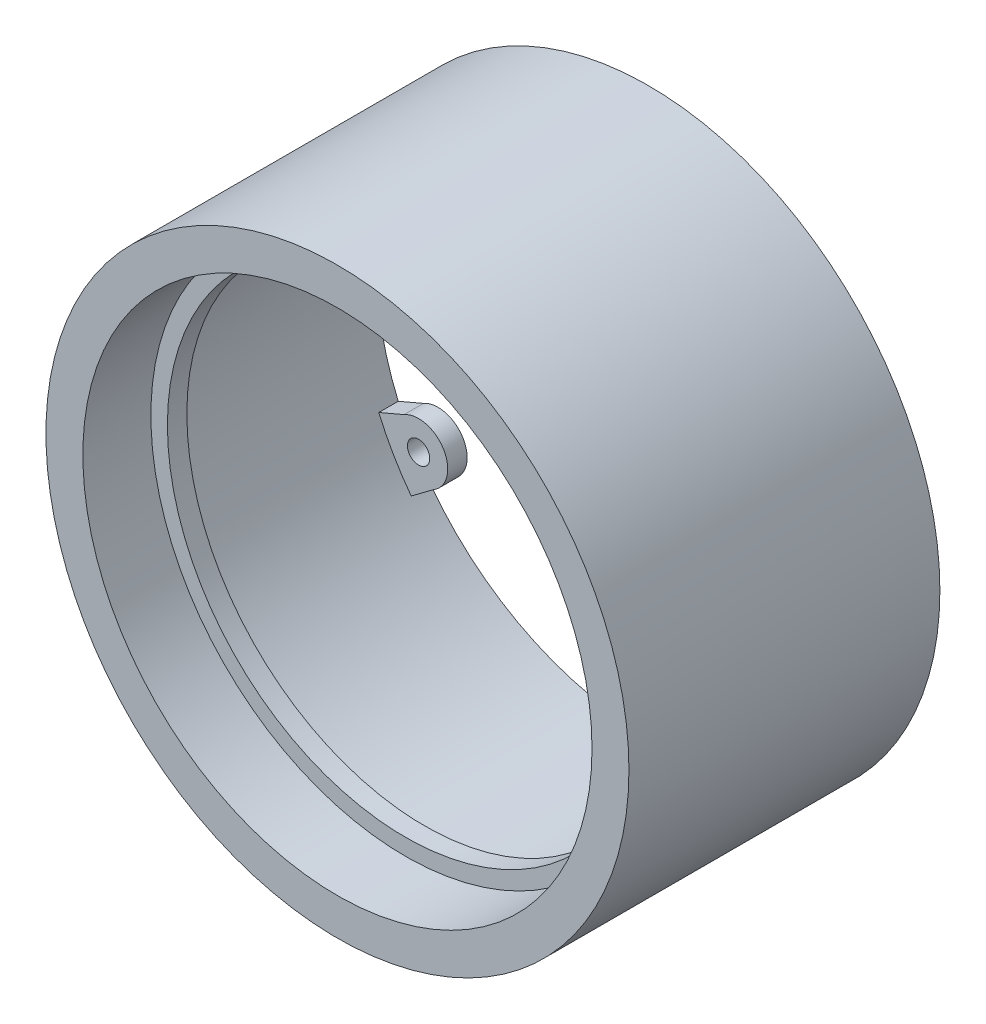
ISO-10303-21;
HEADER;
FILE_DESCRIPTION(('STEP AP214'),'2;1');
FILE_NAME('part.step','',(''),(''),'','','');
FILE_SCHEMA(('AUTOMOTIVE_DESIGN { 1 0 10303 214 1 1 1 1 }'));
ENDSEC;
DATA;
#1=APPLICATION_CONTEXT('core data for automotive mechanical design processes');
#2=APPLICATION_PROTOCOL_DEFINITION('international standard','automotive_design',2000,#1);
#3=PRODUCT_CONTEXT('',#1,'mechanical');
#4=PRODUCT('Part','Part','',(#3));
#5=PRODUCT_RELATED_PRODUCT_CATEGORY('part','',(#4));
#6=PRODUCT_DEFINITION_FORMATION('','',#4);
#7=PRODUCT_DEFINITION_CONTEXT('part definition',#1,'design');
#8=PRODUCT_DEFINITION('design','',#6,#7);
#9=PRODUCT_DEFINITION_SHAPE('','',#8);
#10=(LENGTH_UNIT() NAMED_UNIT(*) SI_UNIT(.MILLI.,.METRE.));
#11=(NAMED_UNIT(*) PLANE_ANGLE_UNIT() SI_UNIT($,.RADIAN.));
#12=(NAMED_UNIT(*) SI_UNIT($,.STERADIAN.) SOLID_ANGLE_UNIT());
#13=UNCERTAINTY_MEASURE_WITH_UNIT(LENGTH_MEASURE(1.E-05),#10,'distance_accuracy_value','');
#14=(GEOMETRIC_REPRESENTATION_CONTEXT(3) GLOBAL_UNCERTAINTY_ASSIGNED_CONTEXT((#13)) GLOBAL_UNIT_ASSIGNED_CONTEXT((#10,
#11,#12)) REPRESENTATION_CONTEXT('',''));
#15=CARTESIAN_POINT('',(0.,0.,0.));
#16=DIRECTION('',(0.,0.,1.));
#17=DIRECTION('',(1.,0.,0.));
#18=AXIS2_PLACEMENT_3D('',#15,#16,#17);
#19=CARTESIAN_POINT('',(0.,0.,25.));
#20=DIRECTION('',(0.,0.,1.));
#21=DIRECTION('',(1.,0.,0.));
#22=AXIS2_PLACEMENT_3D('',#19,#20,#21);
#23=PLANE('',#22);
#24=CARTESIAN_POINT('',(0.,0.,25.));
#25=DIRECTION('',(0.,0.,1.));
#26=DIRECTION('',(1.,0.,0.));
#27=AXIS2_PLACEMENT_3D('',#24,#25,#26);
#28=CIRCLE('',#27,24.5);
#29=CARTESIAN_POINT('',(24.5,0.,25.));
#30=VERTEX_POINT('',#29);
#31=EDGE_CURVE('E409',#30,#30,#28,.T.);
#32=ORIENTED_EDGE('',*,*,#31,.F.);
#33=EDGE_LOOP('',(#32));
#34=FACE_BOUND('',#33,.T.);
#35=CARTESIAN_POINT('',(0.,0.,25.));
#36=DIRECTION('',(0.,0.,1.));
#37=DIRECTION('',(1.,0.,0.));
#38=AXIS2_PLACEMENT_3D('',#35,#36,#37);
#39=CIRCLE('',#38,26.2);
#40=CARTESIAN_POINT('',(26.2,0.,25.));
#41=VERTEX_POINT('',#40);
#42=EDGE_CURVE('E620',#41,#41,#39,.T.);
#43=ORIENTED_EDGE('',*,*,#42,.T.);
#44=EDGE_LOOP('',(#43));
#45=FACE_BOUND('',#44,.T.);
#46=ADVANCED_FACE('F45',(#34,#45),#23,.T.);
#47=CARTESIAN_POINT('',(0.,0.,23.));
#48=DIRECTION('',(0.,0.,-1.));
#49=DIRECTION('',(-1.,0.,0.));
#50=AXIS2_PLACEMENT_3D('',#47,#48,#49);
#51=CYLINDRICAL_SURFACE('',#50,28.);
#52=CARTESIAN_POINT('',(0.,0.,23.));
#53=DIRECTION('',(0.,0.,1.));
#54=DIRECTION('',(1.,0.,0.));
#55=AXIS2_PLACEMENT_3D('',#52,#53,#54);
#56=CIRCLE('',#55,28.);
#57=CARTESIAN_POINT('',(28.,0.,23.));
#58=VERTEX_POINT('',#57);
#59=EDGE_CURVE('E365',#58,#58,#56,.T.);
#60=ORIENTED_EDGE('',*,*,#59,.T.);
#61=EDGE_LOOP('',(#60));
#62=FACE_BOUND('',#61,.T.);
#63=CARTESIAN_POINT('',(0.,0.,2.));
#64=DIRECTION('',(0.,0.,1.));
#65=DIRECTION('',(-1.,0.,0.));
#66=AXIS2_PLACEMENT_3D('',#63,#64,#65);
#67=CIRCLE('',#66,28.);
#68=CARTESIAN_POINT('',(3.33606617731603,27.8005514776338,2.));
#69=VERTEX_POINT('',#68);
#70=CARTESIAN_POINT('',(-3.33606617731606,27.8005514776338,2.));
#71=VERTEX_POINT('',#70);
#72=EDGE_CURVE('E194',#69,#71,#67,.T.);
#73=ORIENTED_EDGE('',*,*,#72,.F.);
#74=DIRECTION('',(0.,0.,-1.));
#75=VECTOR('',#74,1.);
#76=CARTESIAN_POINT('',(3.33606617731603,27.8005514776338,2.));
#77=LINE('',#76,#75);
#78=CARTESIAN_POINT('',(3.33606617731603,27.8005514776338,0.));
#79=VERTEX_POINT('',#78);
#80=EDGE_CURVE('E190',#69,#79,#77,.T.);
#81=ORIENTED_EDGE('',*,*,#80,.T.);
#82=CARTESIAN_POINT('',(0.,0.,0.));
#83=DIRECTION('',(0.,0.,1.));
#84=DIRECTION('',(1.,0.,0.));
#85=AXIS2_PLACEMENT_3D('',#82,#83,#84);
#86=CIRCLE('',#85,28.);
#87=CARTESIAN_POINT('',(22.4079507301899,16.7893937970787,0.));
#88=VERTEX_POINT('',#87);
#89=EDGE_CURVE('E54',#88,#79,#86,.T.);
#90=ORIENTED_EDGE('',*,*,#89,.F.);
#91=DIRECTION('',(0.,0.,-1.));
#92=VECTOR('',#91,1.);
#93=CARTESIAN_POINT('',(22.4079507301899,16.7893937970787,2.));
#94=LINE('',#93,#92);
#95=CARTESIAN_POINT('',(22.4079507301899,16.7893937970787,2.));
#96=VERTEX_POINT('',#95);
#97=EDGE_CURVE('E228',#96,#88,#94,.T.);
#98=ORIENTED_EDGE('',*,*,#97,.F.);
#99=CARTESIAN_POINT('',(0.,0.,2.));
#100=DIRECTION('',(0.,0.,1.));
#101=DIRECTION('',(-1.,0.,0.));
#102=AXIS2_PLACEMENT_3D('',#99,#100,#101);
#103=CIRCLE('',#102,28.);
#104=CARTESIAN_POINT('',(25.7440169075059,11.0111576805552,2.));
#105=VERTEX_POINT('',#104);
#106=EDGE_CURVE('E249',#105,#96,#103,.T.);
#107=ORIENTED_EDGE('',*,*,#106,.F.);
#108=DIRECTION('',(0.,0.,-1.));
#109=VECTOR('',#108,1.);
#110=CARTESIAN_POINT('',(25.7440169075059,11.0111576805552,2.));
#111=LINE('',#110,#109);
#112=CARTESIAN_POINT('',(25.7440169075059,11.0111576805552,0.));
#113=VERTEX_POINT('',#112);
#114=EDGE_CURVE('E223',#105,#113,#111,.T.);
#115=ORIENTED_EDGE('',*,*,#114,.T.);
#116=CARTESIAN_POINT('',(25.7440169075059,-11.0111576805552,0.));
#117=VERTEX_POINT('',#116);
#118=EDGE_CURVE('E209',#117,#113,#86,.T.);
#119=ORIENTED_EDGE('',*,*,#118,.F.);
#120=DIRECTION('',(0.,0.,-1.));
#121=VECTOR('',#120,1.);
#122=CARTESIAN_POINT('',(25.7440169075059,-11.0111576805552,2.));
#123=LINE('',#122,#121);
#124=CARTESIAN_POINT('',(25.7440169075059,-11.0111576805552,2.));
#125=VERTEX_POINT('',#124);
#126=EDGE_CURVE('E275',#125,#117,#123,.T.);
#127=ORIENTED_EDGE('',*,*,#126,.F.);
#128=CARTESIAN_POINT('',(0.,0.,2.));
#129=DIRECTION('',(0.,0.,1.));
#130=DIRECTION('',(-1.,0.,0.));
#131=AXIS2_PLACEMENT_3D('',#128,#129,#130);
#132=CIRCLE('',#131,28.);
#133=CARTESIAN_POINT('',(22.4079507301899,-16.7893937970786,2.));
#134=VERTEX_POINT('',#133);
#135=EDGE_CURVE('E297',#134,#125,#132,.T.);
#136=ORIENTED_EDGE('',*,*,#135,.F.);
#137=DIRECTION('',(0.,0.,-1.));
#138=VECTOR('',#137,1.);
#139=CARTESIAN_POINT('',(22.4079507301899,-16.7893937970786,2.));
#140=LINE('',#139,#138);
#141=CARTESIAN_POINT('',(22.4079507301899,-16.7893937970786,0.));
#142=VERTEX_POINT('',#141);
#143=EDGE_CURVE('E270',#134,#142,#140,.T.);
#144=ORIENTED_EDGE('',*,*,#143,.T.);
#145=CARTESIAN_POINT('',(-22.4079507301899,-16.7893937970787,0.));
#146=VERTEX_POINT('',#145);
#147=EDGE_CURVE('E214',#146,#142,#86,.T.);
#148=ORIENTED_EDGE('',*,*,#147,.F.);
#149=DIRECTION('',(0.,0.,-1.));
#150=VECTOR('',#149,1.);
#151=CARTESIAN_POINT('',(-22.4079507301899,-16.7893937970787,2.));
#152=LINE('',#151,#150);
#153=CARTESIAN_POINT('',(-22.4079507301899,-16.7893937970787,2.));
#154=VERTEX_POINT('',#153);
#155=EDGE_CURVE('E322',#154,#146,#152,.T.);
#156=ORIENTED_EDGE('',*,*,#155,.F.);
#157=CARTESIAN_POINT('',(0.,0.,2.));
#158=DIRECTION('',(0.,0.,1.));
#159=DIRECTION('',(-1.,0.,0.));
#160=AXIS2_PLACEMENT_3D('',#157,#158,#159);
#161=CIRCLE('',#160,28.);
#162=CARTESIAN_POINT('',(-25.7440169075059,-11.0111576805552,2.));
#163=VERTEX_POINT('',#162);
#164=EDGE_CURVE('E344',#163,#154,#161,.T.);
#165=ORIENTED_EDGE('',*,*,#164,.F.);
#166=DIRECTION('',(0.,0.,-1.));
#167=VECTOR('',#166,1.);
#168=CARTESIAN_POINT('',(-25.7440169075059,-11.0111576805552,2.));
#169=LINE('',#168,#167);
#170=CARTESIAN_POINT('',(-25.7440169075059,-11.0111576805552,0.));
#171=VERTEX_POINT('',#170);
#172=EDGE_CURVE('E317',#163,#171,#169,.T.);
#173=ORIENTED_EDGE('',*,*,#172,.T.);
#174=CARTESIAN_POINT('',(-25.7440169075059,11.0111576805551,0.));
#175=VERTEX_POINT('',#174);
#176=EDGE_CURVE('E460',#175,#171,#86,.T.);
#177=ORIENTED_EDGE('',*,*,#176,.F.);
#178=DIRECTION('',(0.,0.,-1.));
#179=VECTOR('',#178,1.);
#180=CARTESIAN_POINT('',(-25.7440169075059,11.0111576805551,2.));
#181=LINE('',#180,#179);
#182=CARTESIAN_POINT('',(-25.7440169075059,11.0111576805551,2.));
#183=VERTEX_POINT('',#182);
#184=EDGE_CURVE('E369',#183,#175,#181,.T.);
#185=ORIENTED_EDGE('',*,*,#184,.F.);
#186=CARTESIAN_POINT('',(0.,0.,2.));
#187=DIRECTION('',(0.,0.,1.));
#188=DIRECTION('',(-1.,0.,0.));
#189=AXIS2_PLACEMENT_3D('',#186,#187,#188);
#190=CIRCLE('',#189,28.);
#191=CARTESIAN_POINT('',(-22.4079507301899,16.7893937970786,2.));
#192=VERTEX_POINT('',#191);
#193=EDGE_CURVE('E391',#192,#183,#190,.T.);
#194=ORIENTED_EDGE('',*,*,#193,.F.);
#195=DIRECTION('',(0.,0.,-1.));
#196=VECTOR('',#195,1.);
#197=CARTESIAN_POINT('',(-22.4079507301899,16.7893937970786,2.));
#198=LINE('',#197,#196);
#199=CARTESIAN_POINT('',(-22.4079507301899,16.7893937970786,0.));
#200=VERTEX_POINT('',#199);
#201=EDGE_CURVE('E364',#192,#200,#198,.T.);
#202=ORIENTED_EDGE('',*,*,#201,.T.);
#203=CARTESIAN_POINT('',(-3.33606617731606,27.8005514776338,0.));
#204=VERTEX_POINT('',#203);
#205=EDGE_CURVE('E455',#204,#200,#86,.T.);
#206=ORIENTED_EDGE('',*,*,#205,.F.);
#207=DIRECTION('',(0.,0.,-1.));
#208=VECTOR('',#207,1.);
#209=CARTESIAN_POINT('',(-3.33606617731606,27.8005514776338,2.));
#210=LINE('',#209,#208);
#211=EDGE_CURVE('E215',#71,#204,#210,.T.);
#212=ORIENTED_EDGE('',*,*,#211,.F.);
#213=EDGE_LOOP('',(#73,#81,#90,#98,#107,#115,#119,#127,#136,#144,#148,#156,#165,#173,#177,#185,
#194,#202,#206,#212));
#214=FACE_BOUND('',#213,.T.);
#215=ADVANCED_FACE('F456',(#62,#214),#51,.F.);
#216=CARTESIAN_POINT('',(0.,0.,0.));
#217=DIRECTION('',(0.,0.,1.));
#218=DIRECTION('',(1.,0.,0.));
#219=AXIS2_PLACEMENT_3D('',#216,#217,#218);
#220=PLANE('',#219);
#221=CARTESIAN_POINT('',(0.,0.,0.));
#222=DIRECTION('',(0.,0.,1.));
#223=DIRECTION('',(1.,0.,0.));
#224=AXIS2_PLACEMENT_3D('',#221,#222,#223);
#225=CIRCLE('',#224,30.);
#226=CARTESIAN_POINT('',(30.,0.,0.));
#227=VERTEX_POINT('',#226);
#228=EDGE_CURVE('E11',#227,#227,#225,.T.);
#229=ORIENTED_EDGE('',*,*,#228,.F.);
#230=EDGE_LOOP('',(#229));
#231=FACE_BOUND('',#230,.T.);
#232=ORIENTED_EDGE('',*,*,#118,.T.);
#233=DIRECTION('',(0.919429175268066,0.393255631448406,0.));
#234=VECTOR('',#233,1.);
#235=CARTESIAN_POINT('',(23.150635094611,9.90192378864669,0.));
#236=LINE('',#235,#234);
#237=CARTESIAN_POINT('',(23.150635094611,9.90192378864669,0.));
#238=VERTEX_POINT('',#237);
#239=EDGE_CURVE('E238',#238,#113,#236,.T.);
#240=ORIENTED_EDGE('',*,*,#239,.F.);
#241=CARTESIAN_POINT('',(21.650635094611,12.5,0.));
#242=DIRECTION('',(0.,0.,1.));
#243=DIRECTION('',(1.,0.,0.));
#244=AXIS2_PLACEMENT_3D('',#241,#242,#243);
#245=CIRCLE('',#244,3.);
#246=CARTESIAN_POINT('',(20.150635094611,15.0980762113533,0.));
#247=VERTEX_POINT('',#246);
#248=EDGE_CURVE('E242',#247,#238,#245,.T.);
#249=ORIENTED_EDGE('',*,*,#248,.F.);
#250=DIRECTION('',(-0.800283954649639,-0.599621207038522,0.));
#251=VECTOR('',#250,1.);
#252=CARTESIAN_POINT('',(20.150635094611,15.0980762113533,0.));
#253=LINE('',#252,#251);
#254=EDGE_CURVE('E235',#88,#247,#253,.T.);
#255=ORIENTED_EDGE('',*,*,#254,.F.);
#256=ORIENTED_EDGE('',*,*,#89,.T.);
#257=DIRECTION('',(0.119145220618423,0.992876838486923,0.));
#258=VECTOR('',#257,1.);
#259=CARTESIAN_POINT('',(3.,25.,0.));
#260=LINE('',#259,#258);
#261=CARTESIAN_POINT('',(3.,25.,0.));
#262=VERTEX_POINT('',#261);
#263=EDGE_CURVE('E439',#262,#79,#260,.T.);
#264=ORIENTED_EDGE('',*,*,#263,.F.);
#265=CARTESIAN_POINT('',(0.,25.,0.));
#266=DIRECTION('',(0.,0.,1.));
#267=DIRECTION('',(1.,0.,0.));
#268=AXIS2_PLACEMENT_3D('',#265,#266,#267);
#269=CIRCLE('',#268,3.);
#270=CARTESIAN_POINT('',(-3.,25.,0.));
#271=VERTEX_POINT('',#270);
#272=EDGE_CURVE('E207',#271,#262,#269,.T.);
#273=ORIENTED_EDGE('',*,*,#272,.F.);
#274=DIRECTION('',(0.11914522061843,-0.992876838486922,0.));
#275=VECTOR('',#274,1.);
#276=CARTESIAN_POINT('',(-3.,25.,0.));
#277=LINE('',#276,#275);
#278=EDGE_CURVE('E203',#204,#271,#277,.T.);
#279=ORIENTED_EDGE('',*,*,#278,.F.);
#280=ORIENTED_EDGE('',*,*,#205,.T.);
#281=DIRECTION('',(-0.800283954649644,0.599621207038517,0.));
#282=VECTOR('',#281,1.);
#283=CARTESIAN_POINT('',(-20.150635094611,15.0980762113533,0.));
#284=LINE('',#283,#282);
#285=CARTESIAN_POINT('',(-20.150635094611,15.0980762113533,0.));
#286=VERTEX_POINT('',#285);
#287=EDGE_CURVE('E380',#286,#200,#284,.T.);
#288=ORIENTED_EDGE('',*,*,#287,.F.);
#289=CARTESIAN_POINT('',(-21.650635094611,12.5,0.));
#290=DIRECTION('',(0.,0.,1.));
#291=DIRECTION('',(1.,0.,0.));
#292=AXIS2_PLACEMENT_3D('',#289,#290,#291);
#293=CIRCLE('',#292,3.);
#294=CARTESIAN_POINT('',(-23.150635094611,9.90192378864667,0.));
#295=VERTEX_POINT('',#294);
#296=EDGE_CURVE('E384',#295,#286,#293,.T.);
#297=ORIENTED_EDGE('',*,*,#296,.F.);
#298=DIRECTION('',(0.919429175268069,-0.393255631448398,0.));
#299=VECTOR('',#298,1.);
#300=CARTESIAN_POINT('',(-23.150635094611,9.90192378864667,0.));
#301=LINE('',#300,#299);
#302=EDGE_CURVE('E377',#175,#295,#301,.T.);
#303=ORIENTED_EDGE('',*,*,#302,.F.);
#304=ORIENTED_EDGE('',*,*,#176,.T.);
#305=DIRECTION('',(-0.919429175268065,-0.393255631448407,0.));
#306=VECTOR('',#305,1.);
#307=CARTESIAN_POINT('',(-23.150635094611,-9.9019237886467,0.));
#308=LINE('',#307,#306);
#309=CARTESIAN_POINT('',(-23.150635094611,-9.9019237886467,0.));
#310=VERTEX_POINT('',#309);
#311=EDGE_CURVE('E333',#310,#171,#308,.T.);
#312=ORIENTED_EDGE('',*,*,#311,.F.);
#313=CARTESIAN_POINT('',(-21.650635094611,-12.5,0.));
#314=DIRECTION('',(0.,0.,1.));
#315=DIRECTION('',(1.,0.,0.));
#316=AXIS2_PLACEMENT_3D('',#313,#314,#315);
#317=CIRCLE('',#316,3.);
#318=CARTESIAN_POINT('',(-20.150635094611,-15.0980762113533,0.));
#319=VERTEX_POINT('',#318);
#320=EDGE_CURVE('E337',#319,#310,#317,.T.);
#321=ORIENTED_EDGE('',*,*,#320,.F.);
#322=DIRECTION('',(0.800283954649638,0.599621207038523,0.));
#323=VECTOR('',#322,1.);
#324=CARTESIAN_POINT('',(-20.150635094611,-15.0980762113533,0.));
#325=LINE('',#324,#323);
#326=EDGE_CURVE('E330',#146,#319,#325,.T.);
#327=ORIENTED_EDGE('',*,*,#326,.F.);
#328=ORIENTED_EDGE('',*,*,#147,.T.);
#329=DIRECTION('',(0.800283954649643,-0.599621207038517,0.));
#330=VECTOR('',#329,1.);
#331=CARTESIAN_POINT('',(20.150635094611,-15.0980762113533,0.));
#332=LINE('',#331,#330);
#333=CARTESIAN_POINT('',(20.150635094611,-15.0980762113533,0.));
#334=VERTEX_POINT('',#333);
#335=EDGE_CURVE('E286',#334,#142,#332,.T.);
#336=ORIENTED_EDGE('',*,*,#335,.F.);
#337=CARTESIAN_POINT('',(21.650635094611,-12.5,0.));
#338=DIRECTION('',(0.,0.,1.));
#339=DIRECTION('',(1.,0.,0.));
#340=AXIS2_PLACEMENT_3D('',#337,#338,#339);
#341=CIRCLE('',#340,3.);
#342=CARTESIAN_POINT('',(23.150635094611,-9.90192378864668,0.));
#343=VERTEX_POINT('',#342);
#344=EDGE_CURVE('E290',#343,#334,#341,.T.);
#345=ORIENTED_EDGE('',*,*,#344,.F.);
#346=DIRECTION('',(-0.919429175268069,0.393255631448399,0.));
#347=VECTOR('',#346,1.);
#348=CARTESIAN_POINT('',(23.150635094611,-9.90192378864668,0.));
#349=LINE('',#348,#347);
#350=EDGE_CURVE('E283',#117,#343,#349,.T.);
#351=ORIENTED_EDGE('',*,*,#350,.F.);
#352=EDGE_LOOP('',(#232,#240,#249,#255,#256,#264,#273,#279,#280,#288,#297,#303,#304,#312,#321,
#327,#328,#336,#345,#351));
#353=FACE_BOUND('',#352,.T.);
#354=CARTESIAN_POINT('',(-21.650635094611,12.5,0.));
#355=DIRECTION('',(0.,0.,1.));
#356=DIRECTION('',(1.,0.,0.));
#357=AXIS2_PLACEMENT_3D('',#354,#355,#356);
#358=CIRCLE('',#357,1.15);
#359=CARTESIAN_POINT('',(-20.500635094611,12.5,0.));
#360=VERTEX_POINT('',#359);
#361=EDGE_CURVE('E318',#360,#360,#358,.T.);
#362=ORIENTED_EDGE('',*,*,#361,.T.);
#363=EDGE_LOOP('',(#362));
#364=FACE_BOUND('',#363,.T.);
#365=CARTESIAN_POINT('',(-21.650635094611,-12.5,0.));
#366=DIRECTION('',(0.,0.,1.));
#367=DIRECTION('',(1.,0.,0.));
#368=AXIS2_PLACEMENT_3D('',#365,#366,#367);
#369=CIRCLE('',#368,1.15);
#370=CARTESIAN_POINT('',(-20.500635094611,-12.5,0.));
#371=VERTEX_POINT('',#370);
#372=EDGE_CURVE('E271',#371,#371,#369,.T.);
#373=ORIENTED_EDGE('',*,*,#372,.T.);
#374=EDGE_LOOP('',(#373));
#375=FACE_BOUND('',#374,.T.);
#376=CARTESIAN_POINT('',(21.650635094611,-12.5,0.));
#377=DIRECTION('',(0.,0.,1.));
#378=DIRECTION('',(1.,0.,0.));
#379=AXIS2_PLACEMENT_3D('',#376,#377,#378);
#380=CIRCLE('',#379,1.15);
#381=CARTESIAN_POINT('',(22.800635094611,-12.5,0.));
#382=VERTEX_POINT('',#381);
#383=EDGE_CURVE('E224',#382,#382,#380,.T.);
#384=ORIENTED_EDGE('',*,*,#383,.T.);
#385=EDGE_LOOP('',(#384));
#386=FACE_BOUND('',#385,.T.);
#387=CARTESIAN_POINT('',(21.650635094611,12.5,0.));
#388=DIRECTION('',(0.,0.,1.));
#389=DIRECTION('',(1.,0.,0.));
#390=AXIS2_PLACEMENT_3D('',#387,#388,#389);
#391=CIRCLE('',#390,1.15);
#392=CARTESIAN_POINT('',(22.800635094611,12.5,0.));
#393=VERTEX_POINT('',#392);
#394=EDGE_CURVE('E258',#393,#393,#391,.T.);
#395=ORIENTED_EDGE('',*,*,#394,.T.);
#396=EDGE_LOOP('',(#395));
#397=FACE_BOUND('',#396,.T.);
#398=CARTESIAN_POINT('',(0.,25.,0.));
#399=DIRECTION('',(0.,0.,1.));
#400=DIRECTION('',(1.,0.,0.));
#401=AXIS2_PLACEMENT_3D('',#398,#399,#400);
#402=CIRCLE('',#401,1.15);
#403=CARTESIAN_POINT('',(1.15,25.,0.));
#404=VERTEX_POINT('',#403);
#405=EDGE_CURVE('E262',#404,#404,#402,.T.);
#406=ORIENTED_EDGE('',*,*,#405,.T.);
#407=EDGE_LOOP('',(#406));
#408=FACE_BOUND('',#407,.T.);
#409=ADVANCED_FACE('F453',(#231,#353,#364,#375,#386,#397,#408),#220,.F.);
#410=CARTESIAN_POINT('',(0.,0.,23.));
#411=DIRECTION('',(0.,0.,-1.));
#412=DIRECTION('',(-1.,0.,0.));
#413=AXIS2_PLACEMENT_3D('',#410,#411,#412);
#414=CYLINDRICAL_SURFACE('',#413,30.);
#415=ORIENTED_EDGE('',*,*,#228,.T.);
#416=EDGE_LOOP('',(#415));
#417=FACE_BOUND('',#416,.T.);
#418=CARTESIAN_POINT('',(0.,0.,32.));
#419=DIRECTION('',(0.,0.,1.));
#420=DIRECTION('',(1.,0.,0.));
#421=AXIS2_PLACEMENT_3D('',#418,#419,#420);
#422=CIRCLE('',#421,30.);
#423=CARTESIAN_POINT('',(30.,0.,32.));
#424=VERTEX_POINT('',#423);
#425=EDGE_CURVE('E420',#424,#424,#422,.T.);
#426=ORIENTED_EDGE('',*,*,#425,.F.);
#427=EDGE_LOOP('',(#426));
#428=FACE_BOUND('',#427,.T.);
#429=ADVANCED_FACE('F47',(#417,#428),#414,.T.);
#430=CARTESIAN_POINT('',(-21.650635094611,12.5,2.));
#431=DIRECTION('',(0.,0.,1.));
#432=DIRECTION('',(1.,0.,0.));
#433=AXIS2_PLACEMENT_3D('',#430,#431,#432);
#434=PLANE('',#433);
#435=CARTESIAN_POINT('',(-21.650635094611,12.5,2.));
#436=DIRECTION('',(0.,0.,1.));
#437=DIRECTION('',(1.,0.,0.));
#438=AXIS2_PLACEMENT_3D('',#435,#436,#437);
#439=CIRCLE('',#438,3.);
#440=CARTESIAN_POINT('',(-23.150635094611,9.90192378864667,2.));
#441=VERTEX_POINT('',#440);
#442=CARTESIAN_POINT('',(-20.150635094611,15.0980762113533,2.));
#443=VERTEX_POINT('',#442);
#444=EDGE_CURVE('E381',#441,#443,#439,.T.);
#445=ORIENTED_EDGE('',*,*,#444,.T.);
#446=DIRECTION('',(-0.800283954649644,0.599621207038517,0.));
#447=VECTOR('',#446,1.);
#448=CARTESIAN_POINT('',(-20.150635094611,15.0980762113533,2.));
#449=LINE('',#448,#447);
#450=EDGE_CURVE('E395',#443,#192,#449,.T.);
#451=ORIENTED_EDGE('',*,*,#450,.T.);
#452=ORIENTED_EDGE('',*,*,#193,.T.);
#453=DIRECTION('',(0.919429175268069,-0.393255631448398,0.));
#454=VECTOR('',#453,1.);
#455=CARTESIAN_POINT('',(-23.150635094611,9.90192378864667,2.));
#456=LINE('',#455,#454);
#457=EDGE_CURVE('E376',#183,#441,#456,.T.);
#458=ORIENTED_EDGE('',*,*,#457,.T.);
#459=EDGE_LOOP('',(#445,#451,#452,#458));
#460=FACE_BOUND('',#459,.T.);
#461=CARTESIAN_POINT('',(-21.650635094611,12.5,2.));
#462=DIRECTION('',(0.,0.,1.));
#463=DIRECTION('',(1.,0.,0.));
#464=AXIS2_PLACEMENT_3D('',#461,#462,#463);
#465=CIRCLE('',#464,1.15);
#466=CARTESIAN_POINT('',(-20.500635094611,12.5,2.));
#467=VERTEX_POINT('',#466);
#468=EDGE_CURVE('E388',#467,#467,#465,.T.);
#469=ORIENTED_EDGE('',*,*,#468,.F.);
#470=EDGE_LOOP('',(#469));
#471=FACE_BOUND('',#470,.T.);
#472=ADVANCED_FACE('F592',(#460,#471),#434,.T.);
#473=CARTESIAN_POINT('',(-21.650635094611,12.5,2.));
#474=DIRECTION('',(0.,0.,-1.));
#475=DIRECTION('',(-1.,0.,0.));
#476=AXIS2_PLACEMENT_3D('',#473,#474,#475);
#477=CYLINDRICAL_SURFACE('',#476,3.);
#478=ORIENTED_EDGE('',*,*,#296,.T.);
#479=DIRECTION('',(0.,0.,-1.));
#480=VECTOR('',#479,1.);
#481=CARTESIAN_POINT('',(-20.150635094611,15.0980762113533,2.));
#482=LINE('',#481,#480);
#483=EDGE_CURVE('E360',#443,#286,#482,.T.);
#484=ORIENTED_EDGE('',*,*,#483,.F.);
#485=ORIENTED_EDGE('',*,*,#444,.F.);
#486=DIRECTION('',(0.,0.,-1.));
#487=VECTOR('',#486,1.);
#488=CARTESIAN_POINT('',(-23.150635094611,9.90192378864667,2.));
#489=LINE('',#488,#487);
#490=EDGE_CURVE('E372',#441,#295,#489,.T.);
#491=ORIENTED_EDGE('',*,*,#490,.T.);
#492=EDGE_LOOP('',(#478,#484,#485,#491));
#493=FACE_BOUND('',#492,.T.);
#494=ADVANCED_FACE('F588',(#493),#477,.T.);
#495=CARTESIAN_POINT('',(-20.150635094611,15.0980762113533,2.));
#496=DIRECTION('',(-0.599621207038517,-0.800283954649644,0.));
#497=DIRECTION('',(0.800283954649644,-0.599621207038517,0.));
#498=AXIS2_PLACEMENT_3D('',#495,#496,#497);
#499=PLANE('',#498);
#500=ORIENTED_EDGE('',*,*,#287,.T.);
#501=ORIENTED_EDGE('',*,*,#201,.F.);
#502=ORIENTED_EDGE('',*,*,#450,.F.);
#503=ORIENTED_EDGE('',*,*,#483,.T.);
#504=EDGE_LOOP('',(#500,#501,#502,#503));
#505=FACE_BOUND('',#504,.T.);
#506=ADVANCED_FACE('F591',(#505),#499,.F.);
#507=CARTESIAN_POINT('',(-23.150635094611,9.90192378864667,2.));
#508=DIRECTION('',(0.393255631448398,0.919429175268069,0.));
#509=DIRECTION('',(-0.919429175268069,0.393255631448398,0.));
#510=AXIS2_PLACEMENT_3D('',#507,#508,#509);
#511=PLANE('',#510);
#512=ORIENTED_EDGE('',*,*,#302,.T.);
#513=ORIENTED_EDGE('',*,*,#490,.F.);
#514=ORIENTED_EDGE('',*,*,#457,.F.);
#515=ORIENTED_EDGE('',*,*,#184,.T.);
#516=EDGE_LOOP('',(#512,#513,#514,#515));
#517=FACE_BOUND('',#516,.T.);
#518=ADVANCED_FACE('F596',(#517),#511,.F.);
#519=CARTESIAN_POINT('',(-21.650635094611,12.5,2.));
#520=DIRECTION('',(0.,0.,-1.));
#521=DIRECTION('',(-1.,0.,0.));
#522=AXIS2_PLACEMENT_3D('',#519,#520,#521);
#523=CYLINDRICAL_SURFACE('',#522,1.15);
#524=ORIENTED_EDGE('',*,*,#468,.T.);
#525=EDGE_LOOP('',(#524));
#526=FACE_BOUND('',#525,.T.);
#527=ORIENTED_EDGE('',*,*,#361,.F.);
#528=EDGE_LOOP('',(#527));
#529=FACE_BOUND('',#528,.T.);
#530=ADVANCED_FACE('F583',(#526,#529),#523,.F.);
#531=CARTESIAN_POINT('',(-21.650635094611,-12.5,2.));
#532=DIRECTION('',(0.,0.,1.));
#533=DIRECTION('',(1.,0.,0.));
#534=AXIS2_PLACEMENT_3D('',#531,#532,#533);
#535=PLANE('',#534);
#536=CARTESIAN_POINT('',(-21.650635094611,-12.5,2.));
#537=DIRECTION('',(0.,0.,1.));
#538=DIRECTION('',(1.,0.,0.));
#539=AXIS2_PLACEMENT_3D('',#536,#537,#538);
#540=CIRCLE('',#539,3.);
#541=CARTESIAN_POINT('',(-20.150635094611,-15.0980762113533,2.));
#542=VERTEX_POINT('',#541);
#543=CARTESIAN_POINT('',(-23.150635094611,-9.9019237886467,2.));
#544=VERTEX_POINT('',#543);
#545=EDGE_CURVE('E334',#542,#544,#540,.T.);
#546=ORIENTED_EDGE('',*,*,#545,.T.);
#547=DIRECTION('',(-0.919429175268065,-0.393255631448407,0.));
#548=VECTOR('',#547,1.);
#549=CARTESIAN_POINT('',(-23.150635094611,-9.9019237886467,2.));
#550=LINE('',#549,#548);
#551=EDGE_CURVE('E348',#544,#163,#550,.T.);
#552=ORIENTED_EDGE('',*,*,#551,.T.);
#553=ORIENTED_EDGE('',*,*,#164,.T.);
#554=DIRECTION('',(0.800283954649638,0.599621207038523,0.));
#555=VECTOR('',#554,1.);
#556=CARTESIAN_POINT('',(-20.150635094611,-15.0980762113533,2.));
#557=LINE('',#556,#555);
#558=EDGE_CURVE('E329',#154,#542,#557,.T.);
#559=ORIENTED_EDGE('',*,*,#558,.T.);
#560=EDGE_LOOP('',(#546,#552,#553,#559));
#561=FACE_BOUND('',#560,.T.);
#562=CARTESIAN_POINT('',(-21.650635094611,-12.5,2.));
#563=DIRECTION('',(0.,0.,1.));
#564=DIRECTION('',(1.,0.,0.));
#565=AXIS2_PLACEMENT_3D('',#562,#563,#564);
#566=CIRCLE('',#565,1.15);
#567=CARTESIAN_POINT('',(-20.500635094611,-12.5,2.));
#568=VERTEX_POINT('',#567);
#569=EDGE_CURVE('E341',#568,#568,#566,.T.);
#570=ORIENTED_EDGE('',*,*,#569,.F.);
#571=EDGE_LOOP('',(#570));
#572=FACE_BOUND('',#571,.T.);
#573=ADVANCED_FACE('F572',(#561,#572),#535,.T.);
#574=CARTESIAN_POINT('',(-21.650635094611,-12.5,2.));
#575=DIRECTION('',(0.,0.,-1.));
#576=DIRECTION('',(-1.,0.,0.));
#577=AXIS2_PLACEMENT_3D('',#574,#575,#576);
#578=CYLINDRICAL_SURFACE('',#577,3.);
#579=ORIENTED_EDGE('',*,*,#320,.T.);
#580=DIRECTION('',(0.,0.,-1.));
#581=VECTOR('',#580,1.);
#582=CARTESIAN_POINT('',(-23.150635094611,-9.9019237886467,2.));
#583=LINE('',#582,#581);
#584=EDGE_CURVE('E313',#544,#310,#583,.T.);
#585=ORIENTED_EDGE('',*,*,#584,.F.);
#586=ORIENTED_EDGE('',*,*,#545,.F.);
#587=DIRECTION('',(0.,0.,-1.));
#588=VECTOR('',#587,1.);
#589=CARTESIAN_POINT('',(-20.150635094611,-15.0980762113533,2.));
#590=LINE('',#589,#588);
#591=EDGE_CURVE('E325',#542,#319,#590,.T.);
#592=ORIENTED_EDGE('',*,*,#591,.T.);
#593=EDGE_LOOP('',(#579,#585,#586,#592));
#594=FACE_BOUND('',#593,.T.);
#595=ADVANCED_FACE('F568',(#594),#578,.T.);
#596=CARTESIAN_POINT('',(-23.150635094611,-9.9019237886467,2.));
#597=DIRECTION('',(0.393255631448407,-0.919429175268066,0.));
#598=DIRECTION('',(0.919429175268065,0.393255631448407,0.));
#599=AXIS2_PLACEMENT_3D('',#596,#597,#598);
#600=PLANE('',#599);
#601=ORIENTED_EDGE('',*,*,#311,.T.);
#602=ORIENTED_EDGE('',*,*,#172,.F.);
#603=ORIENTED_EDGE('',*,*,#551,.F.);
#604=ORIENTED_EDGE('',*,*,#584,.T.);
#605=EDGE_LOOP('',(#601,#602,#603,#604));
#606=FACE_BOUND('',#605,.T.);
#607=ADVANCED_FACE('F571',(#606),#600,.F.);
#608=CARTESIAN_POINT('',(-20.150635094611,-15.0980762113533,2.));
#609=DIRECTION('',(-0.599621207038523,0.800283954649638,0.));
#610=DIRECTION('',(-0.800283954649638,-0.599621207038523,0.));
#611=AXIS2_PLACEMENT_3D('',#608,#609,#610);
#612=PLANE('',#611);
#613=ORIENTED_EDGE('',*,*,#326,.T.);
#614=ORIENTED_EDGE('',*,*,#591,.F.);
#615=ORIENTED_EDGE('',*,*,#558,.F.);
#616=ORIENTED_EDGE('',*,*,#155,.T.);
#617=EDGE_LOOP('',(#613,#614,#615,#616));
#618=FACE_BOUND('',#617,.T.);
#619=ADVANCED_FACE('F576',(#618),#612,.F.);
#620=CARTESIAN_POINT('',(-21.650635094611,-12.5,2.));
#621=DIRECTION('',(0.,0.,-1.));
#622=DIRECTION('',(-1.,0.,0.));
#623=AXIS2_PLACEMENT_3D('',#620,#621,#622);
#624=CYLINDRICAL_SURFACE('',#623,1.15);
#625=ORIENTED_EDGE('',*,*,#569,.T.);
#626=EDGE_LOOP('',(#625));
#627=FACE_BOUND('',#626,.T.);
#628=ORIENTED_EDGE('',*,*,#372,.F.);
#629=EDGE_LOOP('',(#628));
#630=FACE_BOUND('',#629,.T.);
#631=ADVANCED_FACE('F565',(#627,#630),#624,.F.);
#632=CARTESIAN_POINT('',(21.650635094611,-12.5,2.));
#633=DIRECTION('',(0.,0.,1.));
#634=DIRECTION('',(1.,0.,0.));
#635=AXIS2_PLACEMENT_3D('',#632,#633,#634);
#636=PLANE('',#635);
#637=CARTESIAN_POINT('',(21.650635094611,-12.5,2.));
#638=DIRECTION('',(0.,0.,1.));
#639=DIRECTION('',(1.,0.,0.));
#640=AXIS2_PLACEMENT_3D('',#637,#638,#639);
#641=CIRCLE('',#640,3.);
#642=CARTESIAN_POINT('',(23.150635094611,-9.90192378864668,2.));
#643=VERTEX_POINT('',#642);
#644=CARTESIAN_POINT('',(20.150635094611,-15.0980762113533,2.));
#645=VERTEX_POINT('',#644);
#646=EDGE_CURVE('E287',#643,#645,#641,.T.);
#647=ORIENTED_EDGE('',*,*,#646,.T.);
#648=DIRECTION('',(0.800283954649643,-0.599621207038517,0.));
#649=VECTOR('',#648,1.);
#650=CARTESIAN_POINT('',(20.150635094611,-15.0980762113533,2.));
#651=LINE('',#650,#649);
#652=EDGE_CURVE('E301',#645,#134,#651,.T.);
#653=ORIENTED_EDGE('',*,*,#652,.T.);
#654=ORIENTED_EDGE('',*,*,#135,.T.);
#655=DIRECTION('',(-0.919429175268069,0.393255631448399,0.));
#656=VECTOR('',#655,1.);
#657=CARTESIAN_POINT('',(23.150635094611,-9.90192378864668,2.));
#658=LINE('',#657,#656);
#659=EDGE_CURVE('E282',#125,#643,#658,.T.);
#660=ORIENTED_EDGE('',*,*,#659,.T.);
#661=EDGE_LOOP('',(#647,#653,#654,#660));
#662=FACE_BOUND('',#661,.T.);
#663=CARTESIAN_POINT('',(21.650635094611,-12.5,2.));
#664=DIRECTION('',(0.,0.,1.));
#665=DIRECTION('',(1.,0.,0.));
#666=AXIS2_PLACEMENT_3D('',#663,#664,#665);
#667=CIRCLE('',#666,1.15);
#668=CARTESIAN_POINT('',(22.800635094611,-12.5,2.));
#669=VERTEX_POINT('',#668);
#670=EDGE_CURVE('E294',#669,#669,#667,.T.);
#671=ORIENTED_EDGE('',*,*,#670,.F.);
#672=EDGE_LOOP('',(#671));
#673=FACE_BOUND('',#672,.T.);
#674=ADVANCED_FACE('F559',(#662,#673),#636,.T.);
#675=CARTESIAN_POINT('',(21.650635094611,-12.5,2.));
#676=DIRECTION('',(0.,0.,-1.));
#677=DIRECTION('',(-1.,0.,0.));
#678=AXIS2_PLACEMENT_3D('',#675,#676,#677);
#679=CYLINDRICAL_SURFACE('',#678,3.);
#680=ORIENTED_EDGE('',*,*,#344,.T.);
#681=DIRECTION('',(0.,0.,-1.));
#682=VECTOR('',#681,1.);
#683=CARTESIAN_POINT('',(20.150635094611,-15.0980762113533,2.));
#684=LINE('',#683,#682);
#685=EDGE_CURVE('E266',#645,#334,#684,.T.);
#686=ORIENTED_EDGE('',*,*,#685,.F.);
#687=ORIENTED_EDGE('',*,*,#646,.F.);
#688=DIRECTION('',(0.,0.,-1.));
#689=VECTOR('',#688,1.);
#690=CARTESIAN_POINT('',(23.150635094611,-9.90192378864668,2.));
#691=LINE('',#690,#689);
#692=EDGE_CURVE('E278',#643,#343,#691,.T.);
#693=ORIENTED_EDGE('',*,*,#692,.T.);
#694=EDGE_LOOP('',(#680,#686,#687,#693));
#695=FACE_BOUND('',#694,.T.);
#696=ADVANCED_FACE('F483',(#695),#679,.T.);
#697=CARTESIAN_POINT('',(20.150635094611,-15.0980762113533,2.));
#698=DIRECTION('',(0.599621207038518,0.800283954649643,0.));
#699=DIRECTION('',(-0.800283954649643,0.599621207038518,0.));
#700=AXIS2_PLACEMENT_3D('',#697,#698,#699);
#701=PLANE('',#700);
#702=ORIENTED_EDGE('',*,*,#335,.T.);
#703=ORIENTED_EDGE('',*,*,#143,.F.);
#704=ORIENTED_EDGE('',*,*,#652,.F.);
#705=ORIENTED_EDGE('',*,*,#685,.T.);
#706=EDGE_LOOP('',(#702,#703,#704,#705));
#707=FACE_BOUND('',#706,.T.);
#708=ADVANCED_FACE('F479',(#707),#701,.F.);
#709=CARTESIAN_POINT('',(23.150635094611,-9.90192378864668,2.));
#710=DIRECTION('',(-0.393255631448399,-0.919429175268069,0.));
#711=DIRECTION('',(0.919429175268069,-0.393255631448399,0.));
#712=AXIS2_PLACEMENT_3D('',#709,#710,#711);
#713=PLANE('',#712);
#714=ORIENTED_EDGE('',*,*,#350,.T.);
#715=ORIENTED_EDGE('',*,*,#692,.F.);
#716=ORIENTED_EDGE('',*,*,#659,.F.);
#717=ORIENTED_EDGE('',*,*,#126,.T.);
#718=EDGE_LOOP('',(#714,#715,#716,#717));
#719=FACE_BOUND('',#718,.T.);
#720=ADVANCED_FACE('F552',(#719),#713,.F.);
#721=CARTESIAN_POINT('',(21.650635094611,-12.5,2.));
#722=DIRECTION('',(0.,0.,-1.));
#723=DIRECTION('',(-1.,0.,0.));
#724=AXIS2_PLACEMENT_3D('',#721,#722,#723);
#725=CYLINDRICAL_SURFACE('',#724,1.15);
#726=ORIENTED_EDGE('',*,*,#670,.T.);
#727=EDGE_LOOP('',(#726));
#728=FACE_BOUND('',#727,.T.);
#729=ORIENTED_EDGE('',*,*,#383,.F.);
#730=EDGE_LOOP('',(#729));
#731=FACE_BOUND('',#730,.T.);
#732=ADVANCED_FACE('F547',(#728,#731),#725,.F.);
#733=CARTESIAN_POINT('',(21.650635094611,12.5,2.));
#734=DIRECTION('',(0.,0.,1.));
#735=DIRECTION('',(1.,0.,0.));
#736=AXIS2_PLACEMENT_3D('',#733,#734,#735);
#737=PLANE('',#736);
#738=CARTESIAN_POINT('',(21.650635094611,12.5,2.));
#739=DIRECTION('',(0.,0.,1.));
#740=DIRECTION('',(1.,0.,0.));
#741=AXIS2_PLACEMENT_3D('',#738,#739,#740);
#742=CIRCLE('',#741,3.);
#743=CARTESIAN_POINT('',(20.150635094611,15.0980762113533,2.));
#744=VERTEX_POINT('',#743);
#745=CARTESIAN_POINT('',(23.150635094611,9.90192378864669,2.));
#746=VERTEX_POINT('',#745);
#747=EDGE_CURVE('E239',#744,#746,#742,.T.);
#748=ORIENTED_EDGE('',*,*,#747,.T.);
#749=DIRECTION('',(0.919429175268066,0.393255631448406,0.));
#750=VECTOR('',#749,1.);
#751=CARTESIAN_POINT('',(23.150635094611,9.90192378864669,2.));
#752=LINE('',#751,#750);
#753=EDGE_CURVE('E252',#746,#105,#752,.T.);
#754=ORIENTED_EDGE('',*,*,#753,.T.);
#755=ORIENTED_EDGE('',*,*,#106,.T.);
#756=DIRECTION('',(-0.800283954649639,-0.599621207038522,0.));
#757=VECTOR('',#756,1.);
#758=CARTESIAN_POINT('',(20.150635094611,15.0980762113533,2.));
#759=LINE('',#758,#757);
#760=EDGE_CURVE('E69',#96,#744,#759,.T.);
#761=ORIENTED_EDGE('',*,*,#760,.T.);
#762=EDGE_LOOP('',(#748,#754,#755,#761));
#763=FACE_BOUND('',#762,.T.);
#764=CARTESIAN_POINT('',(21.650635094611,12.5,2.));
#765=DIRECTION('',(0.,0.,1.));
#766=DIRECTION('',(1.,0.,0.));
#767=AXIS2_PLACEMENT_3D('',#764,#765,#766);
#768=CIRCLE('',#767,1.15);
#769=CARTESIAN_POINT('',(22.800635094611,12.5,2.));
#770=VERTEX_POINT('',#769);
#771=EDGE_CURVE('E246',#770,#770,#768,.T.);
#772=ORIENTED_EDGE('',*,*,#771,.F.);
#773=EDGE_LOOP('',(#772));
#774=FACE_BOUND('',#773,.T.);
#775=ADVANCED_FACE('F543',(#763,#774),#737,.T.);
#776=CARTESIAN_POINT('',(21.650635094611,12.5,2.));
#777=DIRECTION('',(0.,0.,-1.));
#778=DIRECTION('',(-1.,0.,0.));
#779=AXIS2_PLACEMENT_3D('',#776,#777,#778);
#780=CYLINDRICAL_SURFACE('',#779,3.);
#781=ORIENTED_EDGE('',*,*,#248,.T.);
#782=DIRECTION('',(0.,0.,-1.));
#783=VECTOR('',#782,1.);
#784=CARTESIAN_POINT('',(23.150635094611,9.90192378864669,2.));
#785=LINE('',#784,#783);
#786=EDGE_CURVE('E219',#746,#238,#785,.T.);
#787=ORIENTED_EDGE('',*,*,#786,.F.);
#788=ORIENTED_EDGE('',*,*,#747,.F.);
#789=DIRECTION('',(0.,0.,-1.));
#790=VECTOR('',#789,1.);
#791=CARTESIAN_POINT('',(20.150635094611,15.0980762113533,2.));
#792=LINE('',#791,#790);
#793=EDGE_CURVE('E231',#744,#247,#792,.T.);
#794=ORIENTED_EDGE('',*,*,#793,.T.);
#795=EDGE_LOOP('',(#781,#787,#788,#794));
#796=FACE_BOUND('',#795,.T.);
#797=ADVANCED_FACE('F498',(#796),#780,.T.);
#798=CARTESIAN_POINT('',(23.150635094611,9.90192378864669,2.));
#799=DIRECTION('',(-0.393255631448406,0.919429175268066,0.));
#800=DIRECTION('',(-0.919429175268066,-0.393255631448406,0.));
#801=AXIS2_PLACEMENT_3D('',#798,#799,#800);
#802=PLANE('',#801);
#803=ORIENTED_EDGE('',*,*,#239,.T.);
#804=ORIENTED_EDGE('',*,*,#114,.F.);
#805=ORIENTED_EDGE('',*,*,#753,.F.);
#806=ORIENTED_EDGE('',*,*,#786,.T.);
#807=EDGE_LOOP('',(#803,#804,#805,#806));
#808=FACE_BOUND('',#807,.T.);
#809=ADVANCED_FACE('F492',(#808),#802,.F.);
#810=CARTESIAN_POINT('',(20.150635094611,15.0980762113533,2.));
#811=DIRECTION('',(0.599621207038522,-0.800283954649639,0.));
#812=DIRECTION('',(0.800283954649639,0.599621207038522,0.));
#813=AXIS2_PLACEMENT_3D('',#810,#811,#812);
#814=PLANE('',#813);
#815=ORIENTED_EDGE('',*,*,#254,.T.);
#816=ORIENTED_EDGE('',*,*,#793,.F.);
#817=ORIENTED_EDGE('',*,*,#760,.F.);
#818=ORIENTED_EDGE('',*,*,#97,.T.);
#819=EDGE_LOOP('',(#815,#816,#817,#818));
#820=FACE_BOUND('',#819,.T.);
#821=ADVANCED_FACE('F500',(#820),#814,.F.);
#822=CARTESIAN_POINT('',(21.650635094611,12.5,2.));
#823=DIRECTION('',(0.,0.,-1.));
#824=DIRECTION('',(-1.,0.,0.));
#825=AXIS2_PLACEMENT_3D('',#822,#823,#824);
#826=CYLINDRICAL_SURFACE('',#825,1.15);
#827=ORIENTED_EDGE('',*,*,#771,.T.);
#828=EDGE_LOOP('',(#827));
#829=FACE_BOUND('',#828,.T.);
#830=ORIENTED_EDGE('',*,*,#394,.F.);
#831=EDGE_LOOP('',(#830));
#832=FACE_BOUND('',#831,.T.);
#833=ADVANCED_FACE('F502',(#829,#832),#826,.F.);
#834=CARTESIAN_POINT('',(0.,25.,2.));
#835=DIRECTION('',(0.,0.,1.));
#836=DIRECTION('',(1.,0.,0.));
#837=AXIS2_PLACEMENT_3D('',#834,#835,#836);
#838=PLANE('',#837);
#839=CARTESIAN_POINT('',(0.,25.,2.));
#840=DIRECTION('',(0.,0.,1.));
#841=DIRECTION('',(1.,0.,0.));
#842=AXIS2_PLACEMENT_3D('',#839,#840,#841);
#843=CIRCLE('',#842,3.);
#844=CARTESIAN_POINT('',(-3.,25.,2.));
#845=VERTEX_POINT('',#844);
#846=CARTESIAN_POINT('',(3.,25.,2.));
#847=VERTEX_POINT('',#846);
#848=EDGE_CURVE('E195',#845,#847,#843,.T.);
#849=ORIENTED_EDGE('',*,*,#848,.T.);
#850=DIRECTION('',(0.119145220618423,0.992876838486923,0.));
#851=VECTOR('',#850,1.);
#852=CARTESIAN_POINT('',(3.,25.,2.));
#853=LINE('',#852,#851);
#854=EDGE_CURVE('E183',#847,#69,#853,.T.);
#855=ORIENTED_EDGE('',*,*,#854,.T.);
#856=ORIENTED_EDGE('',*,*,#72,.T.);
#857=DIRECTION('',(0.11914522061843,-0.992876838486922,0.));
#858=VECTOR('',#857,1.);
#859=CARTESIAN_POINT('',(-3.,25.,2.));
#860=LINE('',#859,#858);
#861=EDGE_CURVE('E61',#71,#845,#860,.T.);
#862=ORIENTED_EDGE('',*,*,#861,.T.);
#863=EDGE_LOOP('',(#849,#855,#856,#862));
#864=FACE_BOUND('',#863,.T.);
#865=CARTESIAN_POINT('',(0.,25.,2.));
#866=DIRECTION('',(0.,0.,1.));
#867=DIRECTION('',(1.,0.,0.));
#868=AXIS2_PLACEMENT_3D('',#865,#866,#867);
#869=CIRCLE('',#868,1.15);
#870=CARTESIAN_POINT('',(1.15,25.,2.));
#871=VERTEX_POINT('',#870);
#872=EDGE_CURVE('E425',#871,#871,#869,.T.);
#873=ORIENTED_EDGE('',*,*,#872,.F.);
#874=EDGE_LOOP('',(#873));
#875=FACE_BOUND('',#874,.T.);
#876=ADVANCED_FACE('F198',(#864,#875),#838,.T.);
#877=CARTESIAN_POINT('',(0.,25.,2.));
#878=DIRECTION('',(0.,0.,-1.));
#879=DIRECTION('',(-1.,0.,0.));
#880=AXIS2_PLACEMENT_3D('',#877,#878,#879);
#881=CYLINDRICAL_SURFACE('',#880,3.);
#882=ORIENTED_EDGE('',*,*,#272,.T.);
#883=DIRECTION('',(0.,0.,-1.));
#884=VECTOR('',#883,1.);
#885=CARTESIAN_POINT('',(3.,25.,2.));
#886=LINE('',#885,#884);
#887=EDGE_CURVE('E187',#847,#262,#886,.T.);
#888=ORIENTED_EDGE('',*,*,#887,.F.);
#889=ORIENTED_EDGE('',*,*,#848,.F.);
#890=DIRECTION('',(0.,0.,-1.));
#891=VECTOR('',#890,1.);
#892=CARTESIAN_POINT('',(-3.,25.,2.));
#893=LINE('',#892,#891);
#894=EDGE_CURVE('E436',#845,#271,#893,.T.);
#895=ORIENTED_EDGE('',*,*,#894,.T.);
#896=EDGE_LOOP('',(#882,#888,#889,#895));
#897=FACE_BOUND('',#896,.T.);
#898=ADVANCED_FACE('F205',(#897),#881,.T.);
#899=CARTESIAN_POINT('',(3.,25.,2.));
#900=DIRECTION('',(-0.992876838486923,0.119145220618423,0.));
#901=DIRECTION('',(-0.119145220618423,-0.992876838486923,0.));
#902=AXIS2_PLACEMENT_3D('',#899,#900,#901);
#903=PLANE('',#902);
#904=ORIENTED_EDGE('',*,*,#263,.T.);
#905=ORIENTED_EDGE('',*,*,#80,.F.);
#906=ORIENTED_EDGE('',*,*,#854,.F.);
#907=ORIENTED_EDGE('',*,*,#887,.T.);
#908=EDGE_LOOP('',(#904,#905,#906,#907));
#909=FACE_BOUND('',#908,.T.);
#910=ADVANCED_FACE('F185',(#909),#903,.F.);
#911=CARTESIAN_POINT('',(-3.,25.,2.));
#912=DIRECTION('',(0.992876838486922,0.11914522061843,0.));
#913=DIRECTION('',(-0.11914522061843,0.992876838486922,0.));
#914=AXIS2_PLACEMENT_3D('',#911,#912,#913);
#915=PLANE('',#914);
#916=ORIENTED_EDGE('',*,*,#278,.T.);
#917=ORIENTED_EDGE('',*,*,#894,.F.);
#918=ORIENTED_EDGE('',*,*,#861,.F.);
#919=ORIENTED_EDGE('',*,*,#211,.T.);
#920=EDGE_LOOP('',(#916,#917,#918,#919));
#921=FACE_BOUND('',#920,.T.);
#922=ADVANCED_FACE('F448',(#921),#915,.F.);
#923=CARTESIAN_POINT('',(0.,25.,2.));
#924=DIRECTION('',(0.,0.,-1.));
#925=DIRECTION('',(-1.,0.,0.));
#926=AXIS2_PLACEMENT_3D('',#923,#924,#925);
#927=CYLINDRICAL_SURFACE('',#926,1.15);
#928=ORIENTED_EDGE('',*,*,#872,.T.);
#929=EDGE_LOOP('',(#928));
#930=FACE_BOUND('',#929,.T.);
#931=ORIENTED_EDGE('',*,*,#405,.F.);
#932=EDGE_LOOP('',(#931));
#933=FACE_BOUND('',#932,.T.);
#934=ADVANCED_FACE('F529',(#930,#933),#927,.F.);
#935=CARTESIAN_POINT('',(0.,0.,23.));
#936=DIRECTION('',(0.,0.,1.));
#937=DIRECTION('',(1.,0.,0.));
#938=AXIS2_PLACEMENT_3D('',#935,#936,#937);
#939=PLANE('',#938);
#940=CARTESIAN_POINT('',(0.,0.,23.));
#941=DIRECTION('',(0.,0.,1.));
#942=DIRECTION('',(1.,0.,0.));
#943=AXIS2_PLACEMENT_3D('',#940,#941,#942);
#944=CIRCLE('',#943,24.5);
#945=CARTESIAN_POINT('',(24.5,0.,23.));
#946=VERTEX_POINT('',#945);
#947=EDGE_CURVE('E414',#946,#946,#944,.T.);
#948=ORIENTED_EDGE('',*,*,#947,.T.);
#949=EDGE_LOOP('',(#948));
#950=FACE_BOUND('',#949,.T.);
#951=ORIENTED_EDGE('',*,*,#59,.F.);
#952=EDGE_LOOP('',(#951));
#953=FACE_BOUND('',#952,.T.);
#954=ADVANCED_FACE('F526',(#950,#953),#939,.F.);
#955=CARTESIAN_POINT('',(0.,0.,25.));
#956=DIRECTION('',(0.,0.,-1.));
#957=DIRECTION('',(-1.,0.,0.));
#958=AXIS2_PLACEMENT_3D('',#955,#956,#957);
#959=CYLINDRICAL_SURFACE('',#958,24.5);
#960=ORIENTED_EDGE('',*,*,#31,.T.);
#961=EDGE_LOOP('',(#960));
#962=FACE_BOUND('',#961,.T.);
#963=ORIENTED_EDGE('',*,*,#947,.F.);
#964=EDGE_LOOP('',(#963));
#965=FACE_BOUND('',#964,.T.);
#966=ADVANCED_FACE('F524',(#962,#965),#959,.F.);
#967=CARTESIAN_POINT('',(0.,0.,32.));
#968=DIRECTION('',(0.,0.,1.));
#969=DIRECTION('',(1.,0.,0.));
#970=AXIS2_PLACEMENT_3D('',#967,#968,#969);
#971=PLANE('',#970);
#972=ORIENTED_EDGE('',*,*,#425,.T.);
#973=EDGE_LOOP('',(#972));
#974=FACE_BOUND('',#973,.T.);
#975=CARTESIAN_POINT('',(0.,0.,32.));
#976=DIRECTION('',(0.,0.,1.));
#977=DIRECTION('',(1.,0.,0.));
#978=AXIS2_PLACEMENT_3D('',#975,#976,#977);
#979=CIRCLE('',#978,26.2);
#980=CARTESIAN_POINT('',(26.2,0.,32.));
#981=VERTEX_POINT('',#980);
#982=EDGE_CURVE('E617',#981,#981,#979,.T.);
#983=ORIENTED_EDGE('',*,*,#982,.F.);
#984=EDGE_LOOP('',(#983));
#985=FACE_BOUND('',#984,.T.);
#986=ADVANCED_FACE('F630',(#974,#985),#971,.T.);
#987=CARTESIAN_POINT('',(0.,0.,32.));
#988=DIRECTION('',(0.,0.,-1.));
#989=DIRECTION('',(-1.,0.,0.));
#990=AXIS2_PLACEMENT_3D('',#987,#988,#989);
#991=CYLINDRICAL_SURFACE('',#990,26.2);
#992=ORIENTED_EDGE('',*,*,#982,.T.);
#993=EDGE_LOOP('',(#992));
#994=FACE_BOUND('',#993,.T.);
#995=ORIENTED_EDGE('',*,*,#42,.F.);
#996=EDGE_LOOP('',(#995));
#997=FACE_BOUND('',#996,.T.);
#998=ADVANCED_FACE('F628',(#994,#997),#991,.F.);
#999=CLOSED_SHELL('',(#46,#215,#409,#429,#472,#494,#506,#518,#530,#573,#595,#607,#619,#631,#674,
#696,#708,#720,#732,#775,#797,#809,#821,#833,#876,#898,#910,#922,#934,#954,#966,#986,#998));
#1000=MANIFOLD_SOLID_BREP('B2',#999);
#1001=ADVANCED_BREP_SHAPE_REPRESENTATION('',(#18,#1000),#14);
#1002=SHAPE_DEFINITION_REPRESENTATION(#9,#1001);
ENDSEC;
END-ISO-10303-21;
